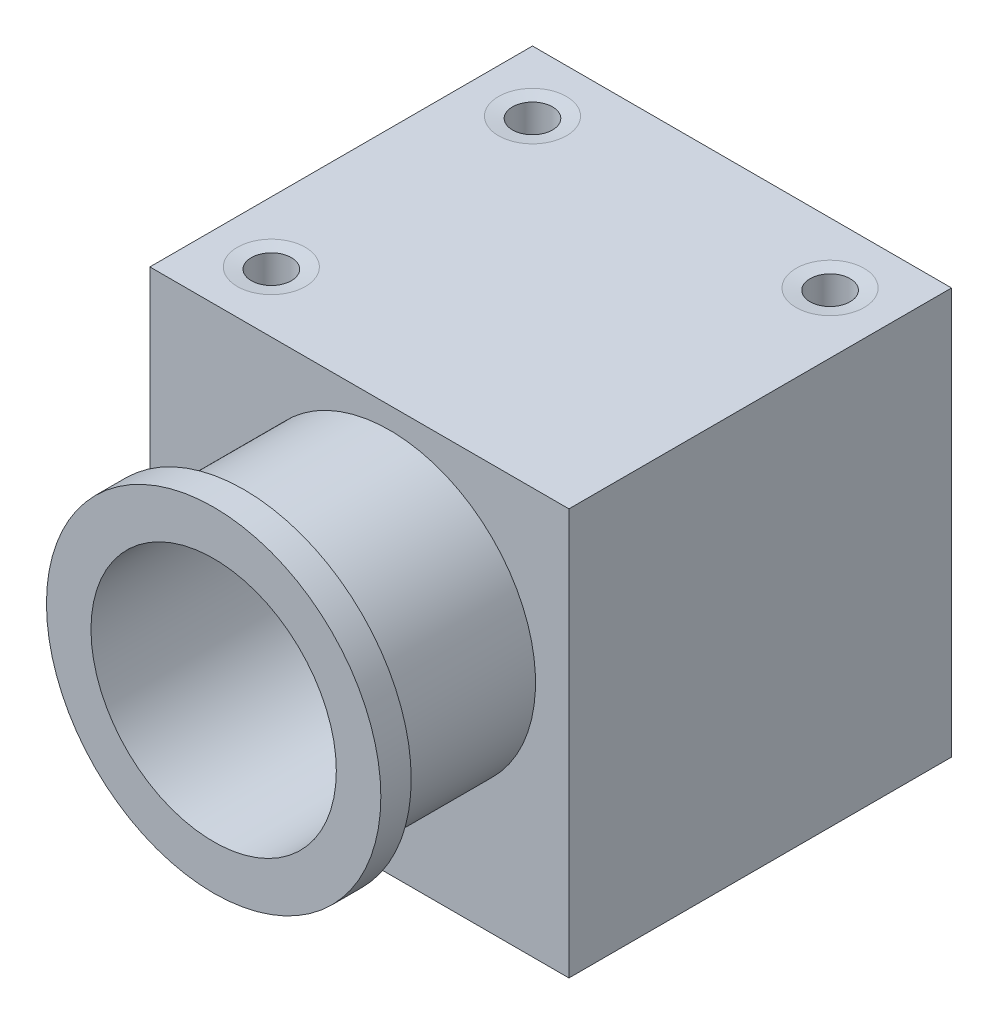
ISO-10303-21;
HEADER;
FILE_DESCRIPTION(('STEP AP214'),'2;1');
FILE_NAME('part.step','',(''),(''),'','','');
FILE_SCHEMA(('AUTOMOTIVE_DESIGN { 1 0 10303 214 1 1 1 1 }'));
ENDSEC;
DATA;
#1=APPLICATION_CONTEXT('core data for automotive mechanical design processes');
#2=APPLICATION_PROTOCOL_DEFINITION('international standard','automotive_design',2000,#1);
#3=PRODUCT_CONTEXT('',#1,'mechanical');
#4=PRODUCT('Part','Part','',(#3));
#5=PRODUCT_RELATED_PRODUCT_CATEGORY('part','',(#4));
#6=PRODUCT_DEFINITION_FORMATION('','',#4);
#7=PRODUCT_DEFINITION_CONTEXT('part definition',#1,'design');
#8=PRODUCT_DEFINITION('design','',#6,#7);
#9=PRODUCT_DEFINITION_SHAPE('','',#8);
#10=(LENGTH_UNIT() NAMED_UNIT(*) SI_UNIT(.MILLI.,.METRE.));
#11=(NAMED_UNIT(*) PLANE_ANGLE_UNIT() SI_UNIT($,.RADIAN.));
#12=(NAMED_UNIT(*) SI_UNIT($,.STERADIAN.) SOLID_ANGLE_UNIT());
#13=UNCERTAINTY_MEASURE_WITH_UNIT(LENGTH_MEASURE(1.E-05),#10,'distance_accuracy_value','');
#14=(GEOMETRIC_REPRESENTATION_CONTEXT(3) GLOBAL_UNCERTAINTY_ASSIGNED_CONTEXT((#13)) GLOBAL_UNIT_ASSIGNED_CONTEXT((#10,
#11,#12)) REPRESENTATION_CONTEXT('',''));
#15=CARTESIAN_POINT('',(0.,0.,0.));
#16=DIRECTION('',(0.,0.,1.));
#17=DIRECTION('',(1.,0.,0.));
#18=AXIS2_PLACEMENT_3D('',#15,#16,#17);
#19=CARTESIAN_POINT('',(0.,1.50369999999999,-18.288));
#20=DIRECTION('',(0.,0.,1.));
#21=DIRECTION('',(1.,0.,0.));
#22=AXIS2_PLACEMENT_3D('',#19,#20,#21);
#23=CYLINDRICAL_SURFACE('',#22,5.1308);
#24=CARTESIAN_POINT('',(0.,1.50369999999999,-18.2626));
#25=DIRECTION('',(0.,0.,-1.));
#26=DIRECTION('',(-1.,0.,0.));
#27=AXIS2_PLACEMENT_3D('',#24,#25,#26);
#28=CIRCLE('',#27,5.1308);
#29=CARTESIAN_POINT('',(-5.1308,1.50369999999999,-18.2626));
#30=VERTEX_POINT('',#29);
#31=EDGE_CURVE('E43',#30,#30,#28,.F.);
#32=ORIENTED_EDGE('',*,*,#31,.T.);
#33=EDGE_LOOP('',(#32));
#34=FACE_BOUND('',#33,.T.);
#35=CARTESIAN_POINT('',(0.,1.50369999999999,-18.288));
#36=DIRECTION('',(0.,0.,1.));
#37=DIRECTION('',(1.,0.,0.));
#38=AXIS2_PLACEMENT_3D('',#35,#36,#37);
#39=CIRCLE('',#38,5.1308);
#40=CARTESIAN_POINT('',(5.1308,1.50369999999999,-18.288));
#41=VERTEX_POINT('',#40);
#42=EDGE_CURVE('E204',#41,#41,#39,.T.);
#43=ORIENTED_EDGE('',*,*,#42,.F.);
#44=EDGE_LOOP('',(#43));
#45=FACE_BOUND('',#44,.T.);
#46=ADVANCED_FACE('F39',(#34,#45),#23,.F.);
#47=CARTESIAN_POINT('',(-7.493,8.49629999999999,-24.1554));
#48=DIRECTION('',(0.,-1.,0.));
#49=DIRECTION('',(0.,0.,-1.));
#50=AXIS2_PLACEMENT_3D('',#47,#48,#49);
#51=PLANE('',#50);
#52=CARTESIAN_POINT('',(-7.493,8.49629999999999,-20.828));
#53=DIRECTION('',(0.,1.,0.));
#54=DIRECTION('',(0.,0.,1.));
#55=AXIS2_PLACEMENT_3D('',#52,#53,#54);
#56=CIRCLE('',#55,1.4224);
#57=CARTESIAN_POINT('',(-7.493,8.49629999999999,-19.4056));
#58=VERTEX_POINT('',#57);
#59=EDGE_CURVE('E166',#58,#58,#56,.T.);
#60=ORIENTED_EDGE('',*,*,#59,.F.);
#61=EDGE_LOOP('',(#60));
#62=FACE_BOUND('',#61,.T.);
#63=DIRECTION('',(0.,0.,-1.));
#64=VECTOR('',#63,1.);
#65=CARTESIAN_POINT('',(-10.033,8.49629999999999,-23.368));
#66=LINE('',#65,#64);
#67=CARTESIAN_POINT('',(-10.033,8.49629999999999,-7.366));
#68=VERTEX_POINT('',#67);
#69=CARTESIAN_POINT('',(-10.033,8.49629999999999,-23.368));
#70=VERTEX_POINT('',#69);
#71=EDGE_CURVE('E156',#68,#70,#66,.T.);
#72=ORIENTED_EDGE('',*,*,#71,.F.);
#73=DIRECTION('',(-1.,0.,0.));
#74=VECTOR('',#73,1.);
#75=CARTESIAN_POINT('',(-7.493,8.49629999999999,-7.366));
#76=LINE('',#75,#74);
#77=CARTESIAN_POINT('',(7.493254,8.49629999999999,-7.366));
#78=VERTEX_POINT('',#77);
#79=EDGE_CURVE('E64',#78,#68,#76,.T.);
#80=ORIENTED_EDGE('',*,*,#79,.F.);
#81=DIRECTION('',(0.,0.,1.));
#82=VECTOR('',#81,1.);
#83=CARTESIAN_POINT('',(7.493254,8.49629999999999,-7.366));
#84=LINE('',#83,#82);
#85=CARTESIAN_POINT('',(7.493254,8.49629999999999,-23.368));
#86=VERTEX_POINT('',#85);
#87=EDGE_CURVE('E179',#86,#78,#84,.T.);
#88=ORIENTED_EDGE('',*,*,#87,.F.);
#89=DIRECTION('',(1.,0.,0.));
#90=VECTOR('',#89,1.);
#91=CARTESIAN_POINT('',(-7.493,8.49629999999999,-23.368));
#92=LINE('',#91,#90);
#93=EDGE_CURVE('E181',#70,#86,#92,.T.);
#94=ORIENTED_EDGE('',*,*,#93,.F.);
#95=EDGE_LOOP('',(#72,#80,#88,#94));
#96=FACE_BOUND('',#95,.T.);
#97=CARTESIAN_POINT('',(4.953254,8.49629999999999,-20.828));
#98=DIRECTION('',(0.,1.,0.));
#99=DIRECTION('',(0.,0.,1.));
#100=AXIS2_PLACEMENT_3D('',#97,#98,#99);
#101=CIRCLE('',#100,1.4224);
#102=CARTESIAN_POINT('',(4.953254,8.49629999999999,-19.4056));
#103=VERTEX_POINT('',#102);
#104=EDGE_CURVE('E162',#103,#103,#101,.T.);
#105=ORIENTED_EDGE('',*,*,#104,.F.);
#106=EDGE_LOOP('',(#105));
#107=FACE_BOUND('',#106,.T.);
#108=CARTESIAN_POINT('',(-7.493,8.49629999999999,-9.906));
#109=DIRECTION('',(0.,1.,0.));
#110=DIRECTION('',(0.,0.,1.));
#111=AXIS2_PLACEMENT_3D('',#108,#109,#110);
#112=CIRCLE('',#111,1.4224);
#113=CARTESIAN_POINT('',(-7.493,8.49629999999999,-8.4836));
#114=VERTEX_POINT('',#113);
#115=EDGE_CURVE('E159',#114,#114,#112,.T.);
#116=ORIENTED_EDGE('',*,*,#115,.F.);
#117=EDGE_LOOP('',(#116));
#118=FACE_BOUND('',#117,.T.);
#119=ADVANCED_FACE('F41',(#62,#96,#107,#118),#51,.F.);
#120=CARTESIAN_POINT('',(-7.493,-11.8237,-9.906));
#121=DIRECTION('',(0.,1.,0.));
#122=DIRECTION('',(0.,0.,1.));
#123=AXIS2_PLACEMENT_3D('',#120,#121,#122);
#124=CYLINDRICAL_SURFACE('',#123,0.838200000000001);
#125=CARTESIAN_POINT('',(-7.493,-8.49630000000001,-9.906));
#126=DIRECTION('',(0.,-1.,0.));
#127=DIRECTION('',(0.,0.,-1.));
#128=AXIS2_PLACEMENT_3D('',#125,#126,#127);
#129=CIRCLE('',#128,0.838200000000001);
#130=CARTESIAN_POINT('',(-7.493,-8.49630000000001,-10.7442));
#131=VERTEX_POINT('',#130);
#132=EDGE_CURVE('E221',#131,#131,#129,.T.);
#133=ORIENTED_EDGE('',*,*,#132,.T.);
#134=EDGE_LOOP('',(#133));
#135=FACE_BOUND('',#134,.T.);
#136=CARTESIAN_POINT('',(-7.493,8.41419604436686,-9.906));
#137=DIRECTION('',(0.,1.,0.));
#138=DIRECTION('',(0.,0.,1.));
#139=AXIS2_PLACEMENT_3D('',#136,#137,#138);
#140=CIRCLE('',#139,0.838200000000001);
#141=CARTESIAN_POINT('',(-7.493,8.41419604436686,-9.0678));
#142=VERTEX_POINT('',#141);
#143=EDGE_CURVE('E11',#142,#142,#140,.T.);
#144=ORIENTED_EDGE('',*,*,#143,.T.);
#145=EDGE_LOOP('',(#144));
#146=FACE_BOUND('',#145,.T.);
#147=ADVANCED_FACE('F258',(#135,#146),#124,.F.);
#148=CARTESIAN_POINT('',(-7.493,-11.8237,-20.828));
#149=DIRECTION('',(0.,1.,0.));
#150=DIRECTION('',(0.,0.,1.));
#151=AXIS2_PLACEMENT_3D('',#148,#149,#150);
#152=CYLINDRICAL_SURFACE('',#151,0.8382);
#153=CARTESIAN_POINT('',(-7.493,-8.49630000000001,-20.828));
#154=DIRECTION('',(0.,-1.,0.));
#155=DIRECTION('',(0.,0.,-1.));
#156=AXIS2_PLACEMENT_3D('',#153,#154,#155);
#157=CIRCLE('',#156,0.8382);
#158=CARTESIAN_POINT('',(-7.493,-8.49630000000001,-21.6662));
#159=VERTEX_POINT('',#158);
#160=EDGE_CURVE('E214',#159,#159,#157,.T.);
#161=ORIENTED_EDGE('',*,*,#160,.T.);
#162=EDGE_LOOP('',(#161));
#163=FACE_BOUND('',#162,.T.);
#164=CARTESIAN_POINT('',(-7.493,8.41419604436686,-20.828));
#165=DIRECTION('',(0.,1.,0.));
#166=DIRECTION('',(0.,0.,1.));
#167=AXIS2_PLACEMENT_3D('',#164,#165,#166);
#168=CIRCLE('',#167,0.8382);
#169=CARTESIAN_POINT('',(-7.493,8.41419604436686,-19.9898));
#170=VERTEX_POINT('',#169);
#171=EDGE_CURVE('E48',#170,#170,#168,.T.);
#172=ORIENTED_EDGE('',*,*,#171,.T.);
#173=EDGE_LOOP('',(#172));
#174=FACE_BOUND('',#173,.T.);
#175=ADVANCED_FACE('F318',(#163,#174),#152,.F.);
#176=CARTESIAN_POINT('',(-7.493,-8.49630000000001,-24.1554));
#177=DIRECTION('',(0.,-1.,0.));
#178=DIRECTION('',(0.,0.,-1.));
#179=AXIS2_PLACEMENT_3D('',#176,#177,#178);
#180=PLANE('',#179);
#181=DIRECTION('',(0.,0.,1.));
#182=VECTOR('',#181,1.);
#183=CARTESIAN_POINT('',(6.59129999999999,-8.49630000000001,-18.2626));
#184=LINE('',#183,#182);
#185=CARTESIAN_POINT('',(6.59129999999999,-8.49630000000001,-18.2626));
#186=VERTEX_POINT('',#185);
#187=CARTESIAN_POINT('',(6.59129999999999,-8.49630000000001,-17.4752));
#188=VERTEX_POINT('',#187);
#189=EDGE_CURVE('E56',#186,#188,#184,.T.);
#190=ORIENTED_EDGE('',*,*,#189,.F.);
#191=DIRECTION('',(1.,0.,0.));
#192=VECTOR('',#191,1.);
#193=CARTESIAN_POINT('',(-6.59130000000001,-8.49630000000001,-18.2626));
#194=LINE('',#193,#192);
#195=CARTESIAN_POINT('',(-6.59130000000001,-8.49630000000001,-18.2626));
#196=VERTEX_POINT('',#195);
#197=EDGE_CURVE('E128',#196,#186,#194,.T.);
#198=ORIENTED_EDGE('',*,*,#197,.F.);
#199=DIRECTION('',(0.,0.,-1.));
#200=VECTOR('',#199,1.);
#201=CARTESIAN_POINT('',(-6.59130000000001,-8.49630000000001,-18.2626));
#202=LINE('',#201,#200);
#203=CARTESIAN_POINT('',(-6.59130000000001,-8.49630000000001,-17.4752));
#204=VERTEX_POINT('',#203);
#205=EDGE_CURVE('E131',#204,#196,#202,.T.);
#206=ORIENTED_EDGE('',*,*,#205,.F.);
#207=DIRECTION('',(-1.,0.,0.));
#208=VECTOR('',#207,1.);
#209=CARTESIAN_POINT('',(-6.59130000000001,-8.49630000000001,-17.4752));
#210=LINE('',#209,#208);
#211=EDGE_CURVE('E137',#188,#204,#210,.T.);
#212=ORIENTED_EDGE('',*,*,#211,.F.);
#213=EDGE_LOOP('',(#190,#198,#206,#212));
#214=FACE_BOUND('',#213,.T.);
#215=ORIENTED_EDGE('',*,*,#160,.F.);
#216=EDGE_LOOP('',(#215));
#217=FACE_BOUND('',#216,.T.);
#218=DIRECTION('',(1.,0.,0.));
#219=VECTOR('',#218,1.);
#220=CARTESIAN_POINT('',(-7.493,-8.49630000000001,-7.366));
#221=LINE('',#220,#219);
#222=CARTESIAN_POINT('',(-10.033,-8.49630000000001,-7.366));
#223=VERTEX_POINT('',#222);
#224=CARTESIAN_POINT('',(7.493254,-8.49630000000001,-7.366));
#225=VERTEX_POINT('',#224);
#226=EDGE_CURVE('E199',#223,#225,#221,.T.);
#227=ORIENTED_EDGE('',*,*,#226,.F.);
#228=DIRECTION('',(0.,0.,1.));
#229=VECTOR('',#228,1.);
#230=CARTESIAN_POINT('',(-10.033,-8.49630000000001,-23.368));
#231=LINE('',#230,#229);
#232=CARTESIAN_POINT('',(-10.033,-8.49630000000001,-23.368));
#233=VERTEX_POINT('',#232);
#234=EDGE_CURVE('E150',#233,#223,#231,.T.);
#235=ORIENTED_EDGE('',*,*,#234,.F.);
#236=DIRECTION('',(-1.,0.,0.));
#237=VECTOR('',#236,1.);
#238=CARTESIAN_POINT('',(-7.493,-8.49630000000001,-23.368));
#239=LINE('',#238,#237);
#240=CARTESIAN_POINT('',(7.493254,-8.49630000000001,-23.368));
#241=VERTEX_POINT('',#240);
#242=EDGE_CURVE('E183',#241,#233,#239,.T.);
#243=ORIENTED_EDGE('',*,*,#242,.F.);
#244=DIRECTION('',(0.,0.,-1.));
#245=VECTOR('',#244,1.);
#246=CARTESIAN_POINT('',(7.493254,-8.49630000000001,-7.366));
#247=LINE('',#246,#245);
#248=EDGE_CURVE('E173',#225,#241,#247,.T.);
#249=ORIENTED_EDGE('',*,*,#248,.F.);
#250=EDGE_LOOP('',(#227,#235,#243,#249));
#251=FACE_BOUND('',#250,.T.);
#252=CARTESIAN_POINT('',(4.953254,-8.49630000000001,-20.828));
#253=DIRECTION('',(0.,-1.,0.));
#254=DIRECTION('',(0.,0.,-1.));
#255=AXIS2_PLACEMENT_3D('',#252,#253,#254);
#256=CIRCLE('',#255,0.838200000000003);
#257=CARTESIAN_POINT('',(4.953254,-8.49630000000001,-21.6662));
#258=VERTEX_POINT('',#257);
#259=EDGE_CURVE('E169',#258,#258,#256,.T.);
#260=ORIENTED_EDGE('',*,*,#259,.F.);
#261=EDGE_LOOP('',(#260));
#262=FACE_BOUND('',#261,.T.);
#263=ORIENTED_EDGE('',*,*,#132,.F.);
#264=EDGE_LOOP('',(#263));
#265=FACE_BOUND('',#264,.T.);
#266=ADVANCED_FACE('F315',(#214,#217,#251,#262,#265),#180,.T.);
#267=CARTESIAN_POINT('',(0.,1.50369999999999,-24.1554));
#268=DIRECTION('',(0.,0.,1.));
#269=DIRECTION('',(1.,0.,0.));
#270=AXIS2_PLACEMENT_3D('',#267,#268,#269);
#271=CYLINDRICAL_SURFACE('',#270,1.4224);
#272=CARTESIAN_POINT('',(0.,1.50369999999999,-19.558));
#273=DIRECTION('',(0.,0.,1.));
#274=DIRECTION('',(1.,0.,0.));
#275=AXIS2_PLACEMENT_3D('',#272,#273,#274);
#276=CIRCLE('',#275,1.4224);
#277=CARTESIAN_POINT('',(1.4224,1.50369999999999,-19.558));
#278=VERTEX_POINT('',#277);
#279=EDGE_CURVE('E211',#278,#278,#276,.F.);
#280=ORIENTED_EDGE('',*,*,#279,.F.);
#281=EDGE_LOOP('',(#280));
#282=FACE_BOUND('',#281,.T.);
#283=CARTESIAN_POINT('',(0.,1.50369999999999,-23.368));
#284=DIRECTION('',(0.,0.,-1.));
#285=DIRECTION('',(-1.,0.,0.));
#286=AXIS2_PLACEMENT_3D('',#283,#284,#285);
#287=CIRCLE('',#286,1.4224);
#288=CARTESIAN_POINT('',(-1.4224,1.50369999999999,-23.368));
#289=VERTEX_POINT('',#288);
#290=EDGE_CURVE('E185',#289,#289,#287,.F.);
#291=ORIENTED_EDGE('',*,*,#290,.F.);
#292=EDGE_LOOP('',(#291));
#293=FACE_BOUND('',#292,.T.);
#294=ADVANCED_FACE('F272',(#282,#293),#271,.F.);
#295=CARTESIAN_POINT('',(0.,0.,-7.366));
#296=DIRECTION('',(0.,0.,1.));
#297=DIRECTION('',(1.,0.,0.));
#298=AXIS2_PLACEMENT_3D('',#295,#296,#297);
#299=PLANE('',#298);
#300=ORIENTED_EDGE('',*,*,#79,.T.);
#301=DIRECTION('',(0.,1.,0.));
#302=VECTOR('',#301,1.);
#303=CARTESIAN_POINT('',(-10.033,8.49629999999999,-7.366));
#304=LINE('',#303,#302);
#305=EDGE_CURVE('E153',#223,#68,#304,.T.);
#306=ORIENTED_EDGE('',*,*,#305,.F.);
#307=ORIENTED_EDGE('',*,*,#226,.T.);
#308=DIRECTION('',(0.,-1.,0.));
#309=VECTOR('',#308,1.);
#310=CARTESIAN_POINT('',(7.493254,8.49629999999999,-7.366));
#311=LINE('',#310,#309);
#312=EDGE_CURVE('E170',#78,#225,#311,.T.);
#313=ORIENTED_EDGE('',*,*,#312,.F.);
#314=EDGE_LOOP('',(#300,#306,#307,#313));
#315=FACE_BOUND('',#314,.T.);
#316=CARTESIAN_POINT('',(0.,1.50369999999999,-7.366));
#317=DIRECTION('',(0.,0.,1.));
#318=DIRECTION('',(1.,0.,0.));
#319=AXIS2_PLACEMENT_3D('',#316,#317,#318);
#320=CIRCLE('',#319,6.096);
#321=CARTESIAN_POINT('',(-6.096,1.50369999999999,-7.366));
#322=VERTEX_POINT('',#321);
#323=EDGE_CURVE('E193',#322,#322,#320,.T.);
#324=ORIENTED_EDGE('',*,*,#323,.F.);
#325=EDGE_LOOP('',(#324));
#326=FACE_BOUND('',#325,.T.);
#327=ADVANCED_FACE('F264',(#315,#326),#299,.T.);
#328=CARTESIAN_POINT('',(0.,1.50369999999999,-17.4752));
#329=DIRECTION('',(0.,0.,1.));
#330=DIRECTION('',(1.,0.,0.));
#331=AXIS2_PLACEMENT_3D('',#328,#329,#330);
#332=CIRCLE('',#331,5.1308);
#333=CARTESIAN_POINT('',(5.1308,1.50369999999999,-17.4752));
#334=VERTEX_POINT('',#333);
#335=EDGE_CURVE('E143',#334,#334,#332,.F.);
#336=ORIENTED_EDGE('',*,*,#335,.T.);
#337=EDGE_LOOP('',(#336));
#338=FACE_BOUND('',#337,.T.);
#339=CARTESIAN_POINT('',(0.,1.50369999999999,0.));
#340=DIRECTION('',(0.,0.,1.));
#341=DIRECTION('',(1.,0.,0.));
#342=AXIS2_PLACEMENT_3D('',#339,#340,#341);
#343=CIRCLE('',#342,5.1308);
#344=CARTESIAN_POINT('',(5.1308,1.50369999999999,0.));
#345=VERTEX_POINT('',#344);
#346=EDGE_CURVE('E186',#345,#345,#343,.T.);
#347=ORIENTED_EDGE('',*,*,#346,.T.);
#348=EDGE_LOOP('',(#347));
#349=FACE_BOUND('',#348,.T.);
#350=ADVANCED_FACE('F254',(#338,#349),#23,.F.);
#351=CARTESIAN_POINT('',(0.,1.50369999999999,-19.558));
#352=DIRECTION('',(0.,0.,1.));
#353=DIRECTION('',(1.,0.,0.));
#354=AXIS2_PLACEMENT_3D('',#351,#352,#353);
#355=CYLINDRICAL_SURFACE('',#354,3.2639);
#356=CARTESIAN_POINT('',(0.,1.50369999999999,-19.558));
#357=DIRECTION('',(0.,0.,1.));
#358=DIRECTION('',(1.,0.,0.));
#359=AXIS2_PLACEMENT_3D('',#356,#357,#358);
#360=CIRCLE('',#359,3.2639);
#361=CARTESIAN_POINT('',(3.2639,1.50369999999999,-19.558));
#362=VERTEX_POINT('',#361);
#363=EDGE_CURVE('E208',#362,#362,#360,.T.);
#364=ORIENTED_EDGE('',*,*,#363,.F.);
#365=EDGE_LOOP('',(#364));
#366=FACE_BOUND('',#365,.T.);
#367=CARTESIAN_POINT('',(0.,1.50369999999999,-18.288));
#368=DIRECTION('',(0.,0.,1.));
#369=DIRECTION('',(1.,0.,0.));
#370=AXIS2_PLACEMENT_3D('',#367,#368,#369);
#371=CIRCLE('',#370,3.2639);
#372=CARTESIAN_POINT('',(3.2639,1.50369999999999,-18.288));
#373=VERTEX_POINT('',#372);
#374=EDGE_CURVE('E207',#373,#373,#371,.F.);
#375=ORIENTED_EDGE('',*,*,#374,.F.);
#376=EDGE_LOOP('',(#375));
#377=FACE_BOUND('',#376,.T.);
#378=ADVANCED_FACE('F263',(#366,#377),#355,.F.);
#379=CARTESIAN_POINT('',(0.,1.50369999999999,-19.558));
#380=DIRECTION('',(0.,0.,1.));
#381=DIRECTION('',(1.,0.,0.));
#382=AXIS2_PLACEMENT_3D('',#379,#380,#381);
#383=PLANE('',#382);
#384=ORIENTED_EDGE('',*,*,#363,.T.);
#385=EDGE_LOOP('',(#384));
#386=FACE_BOUND('',#385,.T.);
#387=ORIENTED_EDGE('',*,*,#279,.T.);
#388=EDGE_LOOP('',(#387));
#389=FACE_BOUND('',#388,.T.);
#390=ADVANCED_FACE('F269',(#386,#389),#383,.T.);
#391=CARTESIAN_POINT('',(0.,1.50369999999999,-18.288));
#392=DIRECTION('',(0.,0.,1.));
#393=DIRECTION('',(1.,0.,0.));
#394=AXIS2_PLACEMENT_3D('',#391,#392,#393);
#395=PLANE('',#394);
#396=ORIENTED_EDGE('',*,*,#42,.T.);
#397=EDGE_LOOP('',(#396));
#398=FACE_BOUND('',#397,.T.);
#399=ORIENTED_EDGE('',*,*,#374,.T.);
#400=EDGE_LOOP('',(#399));
#401=FACE_BOUND('',#400,.T.);
#402=ADVANCED_FACE('F298',(#398,#401),#395,.T.);
#403=CARTESIAN_POINT('',(0.,1.50369999999999,-1.27));
#404=DIRECTION('',(0.,0.,-1.));
#405=DIRECTION('',(-1.,0.,0.));
#406=AXIS2_PLACEMENT_3D('',#403,#404,#405);
#407=CYLINDRICAL_SURFACE('',#406,6.096);
#408=CARTESIAN_POINT('',(0.,1.50369999999999,-1.27));
#409=DIRECTION('',(0.,0.,1.));
#410=DIRECTION('',(1.,0.,0.));
#411=AXIS2_PLACEMENT_3D('',#408,#409,#410);
#412=CIRCLE('',#411,6.096);
#413=CARTESIAN_POINT('',(-6.096,1.50369999999999,-1.27));
#414=VERTEX_POINT('',#413);
#415=EDGE_CURVE('E196',#414,#414,#412,.T.);
#416=CARTESIAN_POINT('',(-6.096,1.50369999999999,-1.27));
#417=CARTESIAN_POINT('',(-6.096,1.50369999999999,-1.3335));
#418=CARTESIAN_POINT('',(-6.096,1.50369999999999,-1.397));
#419=CARTESIAN_POINT('',(-6.096,1.50369999999999,-1.524));
#420=CARTESIAN_POINT('',(-6.096,1.50369999999999,-1.5875));
#421=CARTESIAN_POINT('',(-6.096,1.50369999999999,-1.7145));
#422=CARTESIAN_POINT('',(-6.096,1.50369999999999,-1.778));
#423=CARTESIAN_POINT('',(-6.096,1.50369999999999,-1.905));
#424=CARTESIAN_POINT('',(-6.096,1.50369999999999,-1.9685));
#425=CARTESIAN_POINT('',(-6.096,1.50369999999999,-2.0955));
#426=CARTESIAN_POINT('',(-6.096,1.50369999999999,-2.159));
#427=CARTESIAN_POINT('',(-6.096,1.50369999999999,-2.286));
#428=CARTESIAN_POINT('',(-6.096,1.50369999999999,-2.3495));
#429=CARTESIAN_POINT('',(-6.096,1.50369999999999,-2.4765));
#430=CARTESIAN_POINT('',(-6.096,1.50369999999999,-2.54));
#431=CARTESIAN_POINT('',(-6.096,1.50369999999999,-2.667));
#432=CARTESIAN_POINT('',(-6.096,1.50369999999999,-2.7305));
#433=CARTESIAN_POINT('',(-6.096,1.50369999999999,-2.8575));
#434=CARTESIAN_POINT('',(-6.096,1.50369999999999,-2.921));
#435=CARTESIAN_POINT('',(-6.096,1.50369999999999,-3.048));
#436=CARTESIAN_POINT('',(-6.096,1.50369999999999,-3.1115));
#437=CARTESIAN_POINT('',(-6.096,1.50369999999999,-3.2385));
#438=CARTESIAN_POINT('',(-6.096,1.50369999999999,-3.302));
#439=CARTESIAN_POINT('',(-6.096,1.50369999999999,-3.429));
#440=CARTESIAN_POINT('',(-6.096,1.50369999999999,-3.4925));
#441=CARTESIAN_POINT('',(-6.096,1.50369999999999,-3.6195));
#442=CARTESIAN_POINT('',(-6.096,1.50369999999999,-3.683));
#443=CARTESIAN_POINT('',(-6.096,1.50369999999999,-3.81));
#444=CARTESIAN_POINT('',(-6.096,1.50369999999999,-3.8735));
#445=CARTESIAN_POINT('',(-6.096,1.50369999999999,-4.0005));
#446=CARTESIAN_POINT('',(-6.096,1.50369999999999,-4.064));
#447=CARTESIAN_POINT('',(-6.096,1.50369999999999,-4.191));
#448=CARTESIAN_POINT('',(-6.096,1.50369999999999,-4.2545));
#449=CARTESIAN_POINT('',(-6.096,1.50369999999999,-4.3815));
#450=CARTESIAN_POINT('',(-6.096,1.50369999999999,-4.445));
#451=CARTESIAN_POINT('',(-6.096,1.50369999999999,-4.572));
#452=CARTESIAN_POINT('',(-6.096,1.50369999999999,-4.6355));
#453=CARTESIAN_POINT('',(-6.096,1.50369999999999,-4.7625));
#454=CARTESIAN_POINT('',(-6.096,1.50369999999999,-4.826));
#455=CARTESIAN_POINT('',(-6.096,1.50369999999999,-4.953));
#456=CARTESIAN_POINT('',(-6.096,1.50369999999999,-5.0165));
#457=CARTESIAN_POINT('',(-6.096,1.50369999999999,-5.1435));
#458=CARTESIAN_POINT('',(-6.096,1.50369999999999,-5.207));
#459=CARTESIAN_POINT('',(-6.096,1.50369999999999,-5.334));
#460=CARTESIAN_POINT('',(-6.096,1.50369999999999,-5.3975));
#461=CARTESIAN_POINT('',(-6.096,1.50369999999999,-5.5245));
#462=CARTESIAN_POINT('',(-6.096,1.50369999999999,-5.588));
#463=CARTESIAN_POINT('',(-6.096,1.50369999999999,-5.715));
#464=CARTESIAN_POINT('',(-6.096,1.50369999999999,-5.7785));
#465=CARTESIAN_POINT('',(-6.096,1.50369999999999,-5.9055));
#466=CARTESIAN_POINT('',(-6.096,1.50369999999999,-5.969));
#467=CARTESIAN_POINT('',(-6.096,1.50369999999999,-6.096));
#468=CARTESIAN_POINT('',(-6.096,1.50369999999999,-6.1595));
#469=CARTESIAN_POINT('',(-6.096,1.50369999999999,-6.2865));
#470=CARTESIAN_POINT('',(-6.096,1.50369999999999,-6.35));
#471=CARTESIAN_POINT('',(-6.096,1.50369999999999,-6.477));
#472=CARTESIAN_POINT('',(-6.096,1.50369999999999,-6.5405));
#473=CARTESIAN_POINT('',(-6.096,1.50369999999999,-6.6675));
#474=CARTESIAN_POINT('',(-6.096,1.50369999999999,-6.731));
#475=CARTESIAN_POINT('',(-6.096,1.50369999999999,-6.858));
#476=CARTESIAN_POINT('',(-6.096,1.50369999999999,-6.9215));
#477=CARTESIAN_POINT('',(-6.096,1.50369999999999,-7.0485));
#478=CARTESIAN_POINT('',(-6.096,1.50369999999999,-7.112));
#479=CARTESIAN_POINT('',(-6.096,1.50369999999999,-7.239));
#480=CARTESIAN_POINT('',(-6.096,1.50369999999999,-7.3025));
#481=CARTESIAN_POINT('',(-6.096,1.50369999999999,-7.366));
#482=B_SPLINE_CURVE_WITH_KNOTS('',3,(#416,#417,#418,#419,#420,#421,#422,#423,#424,#425,#426,
#427,#428,#429,#430,#431,#432,#433,#434,#435,#436,#437,#438,#439,#440,#441,#442,#443,#444,#445,
#446,#447,#448,#449,#450,#451,#452,#453,#454,#455,#456,#457,#458,#459,#460,#461,#462,#463,#464,
#465,#466,#467,#468,#469,#470,#471,#472,#473,#474,#475,#476,#477,#478,#479,#480,#481),
.UNSPECIFIED.,.F.,.F.,(4,2,2,2,2,2,2,2,2,2,2,2,2,2,2,2,2,2,2,2,2,2,2,2,2,2,2,2,2,2,2,2,4),(0.,
0.1905,0.381,0.5715,0.762,0.9525,1.143,1.3335,1.524,1.7145,1.905,2.0955,2.286,2.4765,2.667,
2.8575,3.048,3.2385,3.429,3.6195,3.81,4.0005,4.191,4.3815,4.572,4.7625,4.953,5.1435,5.334,
5.5245,5.715,5.9055,6.096),.UNSPECIFIED.);
#483=EDGE_CURVE('BSEAM291',#414,#322,#482,.T.);
#484=ORIENTED_EDGE('',*,*,#415,.F.);
#485=ORIENTED_EDGE('',*,*,#323,.T.);
#486=ORIENTED_EDGE('',*,*,#483,.T.);
#487=ORIENTED_EDGE('',*,*,#483,.F.);
#488=EDGE_LOOP('',(#484,#486,#485,#487));
#489=FACE_BOUND('',#488,.T.);
#490=ADVANCED_FACE('F291',(#489),#407,.T.);
#491=CARTESIAN_POINT('',(0.,1.50369999999999,-1.27));
#492=DIRECTION('',(0.,0.,1.));
#493=DIRECTION('',(1.,0.,0.));
#494=AXIS2_PLACEMENT_3D('',#491,#492,#493);
#495=PLANE('',#494);
#496=CARTESIAN_POINT('',(0.,1.50369999999999,-1.27));
#497=DIRECTION('',(0.,0.,1.));
#498=DIRECTION('',(1.,0.,0.));
#499=AXIS2_PLACEMENT_3D('',#496,#497,#498);
#500=CIRCLE('',#499,6.9926);
#501=CARTESIAN_POINT('',(6.9926,1.50369999999999,-1.27));
#502=VERTEX_POINT('',#501);
#503=EDGE_CURVE('E189',#502,#502,#500,.T.);
#504=ORIENTED_EDGE('',*,*,#503,.F.);
#505=EDGE_LOOP('',(#504));
#506=FACE_BOUND('',#505,.T.);
#507=ORIENTED_EDGE('',*,*,#415,.T.);
#508=EDGE_LOOP('',(#507));
#509=FACE_BOUND('',#508,.T.);
#510=ADVANCED_FACE('F281',(#506,#509),#495,.F.);
#511=CARTESIAN_POINT('',(0.,1.50369999999999,0.));
#512=DIRECTION('',(0.,0.,1.));
#513=DIRECTION('',(1.,0.,0.));
#514=AXIS2_PLACEMENT_3D('',#511,#512,#513);
#515=PLANE('',#514);
#516=CARTESIAN_POINT('',(0.,1.50369999999999,0.));
#517=DIRECTION('',(0.,0.,1.));
#518=DIRECTION('',(1.,0.,0.));
#519=AXIS2_PLACEMENT_3D('',#516,#517,#518);
#520=CIRCLE('',#519,6.9926);
#521=CARTESIAN_POINT('',(6.9926,1.50369999999999,0.));
#522=VERTEX_POINT('',#521);
#523=EDGE_CURVE('E190',#522,#522,#520,.T.);
#524=ORIENTED_EDGE('',*,*,#523,.T.);
#525=EDGE_LOOP('',(#524));
#526=FACE_BOUND('',#525,.T.);
#527=ORIENTED_EDGE('',*,*,#346,.F.);
#528=EDGE_LOOP('',(#527));
#529=FACE_BOUND('',#528,.T.);
#530=ADVANCED_FACE('F278',(#526,#529),#515,.T.);
#531=CARTESIAN_POINT('',(0.,1.50369999999999,0.));
#532=DIRECTION('',(0.,0.,-1.));
#533=DIRECTION('',(-1.,0.,0.));
#534=AXIS2_PLACEMENT_3D('',#531,#532,#533);
#535=CYLINDRICAL_SURFACE('',#534,6.9926);
#536=ORIENTED_EDGE('',*,*,#523,.F.);
#537=EDGE_LOOP('',(#536));
#538=FACE_BOUND('',#537,.T.);
#539=ORIENTED_EDGE('',*,*,#503,.T.);
#540=EDGE_LOOP('',(#539));
#541=FACE_BOUND('',#540,.T.);
#542=ADVANCED_FACE('F280',(#538,#541),#535,.T.);
#543=CARTESIAN_POINT('',(0.,0.,-23.368));
#544=DIRECTION('',(0.,0.,-1.));
#545=DIRECTION('',(-1.,0.,0.));
#546=AXIS2_PLACEMENT_3D('',#543,#544,#545);
#547=PLANE('',#546);
#548=ORIENTED_EDGE('',*,*,#242,.T.);
#549=DIRECTION('',(0.,-1.,0.));
#550=VECTOR('',#549,1.);
#551=CARTESIAN_POINT('',(-10.033,8.49629999999999,-23.368));
#552=LINE('',#551,#550);
#553=EDGE_CURVE('E147',#70,#233,#552,.T.);
#554=ORIENTED_EDGE('',*,*,#553,.F.);
#555=ORIENTED_EDGE('',*,*,#93,.T.);
#556=DIRECTION('',(0.,1.,0.));
#557=VECTOR('',#556,1.);
#558=CARTESIAN_POINT('',(7.493254,8.49629999999999,-23.368));
#559=LINE('',#558,#557);
#560=EDGE_CURVE('E176',#241,#86,#559,.T.);
#561=ORIENTED_EDGE('',*,*,#560,.F.);
#562=EDGE_LOOP('',(#548,#554,#555,#561));
#563=FACE_BOUND('',#562,.T.);
#564=ORIENTED_EDGE('',*,*,#290,.T.);
#565=EDGE_LOOP('',(#564));
#566=FACE_BOUND('',#565,.T.);
#567=ADVANCED_FACE('F288',(#563,#566),#547,.T.);
#568=CARTESIAN_POINT('',(7.493254,0.,0.));
#569=DIRECTION('',(1.,0.,0.));
#570=DIRECTION('',(0.,0.,-1.));
#571=AXIS2_PLACEMENT_3D('',#568,#569,#570);
#572=PLANE('',#571);
#573=ORIENTED_EDGE('',*,*,#312,.T.);
#574=ORIENTED_EDGE('',*,*,#248,.T.);
#575=ORIENTED_EDGE('',*,*,#560,.T.);
#576=ORIENTED_EDGE('',*,*,#87,.T.);
#577=EDGE_LOOP('',(#573,#574,#575,#576));
#578=FACE_BOUND('',#577,.T.);
#579=ADVANCED_FACE('F360',(#578),#572,.T.);
#580=CARTESIAN_POINT('',(4.953254,-11.8237,-20.828));
#581=DIRECTION('',(0.,1.,0.));
#582=DIRECTION('',(0.,0.,1.));
#583=AXIS2_PLACEMENT_3D('',#580,#581,#582);
#584=CYLINDRICAL_SURFACE('',#583,0.838200000000003);
#585=CARTESIAN_POINT('',(4.953254,8.41419604436686,-20.828));
#586=DIRECTION('',(0.,1.,0.));
#587=DIRECTION('',(0.,0.,1.));
#588=AXIS2_PLACEMENT_3D('',#585,#586,#587);
#589=CIRCLE('',#588,0.838200000000003);
#590=CARTESIAN_POINT('',(4.953254,8.41419604436686,-19.9898));
#591=VERTEX_POINT('',#590);
#592=EDGE_CURVE('E165',#591,#591,#589,.T.);
#593=ORIENTED_EDGE('',*,*,#592,.T.);
#594=EDGE_LOOP('',(#593));
#595=FACE_BOUND('',#594,.T.);
#596=ORIENTED_EDGE('',*,*,#259,.T.);
#597=EDGE_LOOP('',(#596));
#598=FACE_BOUND('',#597,.T.);
#599=ADVANCED_FACE('F356',(#595,#598),#584,.F.);
#600=CARTESIAN_POINT('',(-7.493,8.49629999999999,-20.828));
#601=DIRECTION('',(0.,1.,0.));
#602=DIRECTION('',(0.,0.,1.));
#603=AXIS2_PLACEMENT_3D('',#600,#601,#602);
#604=CONICAL_SURFACE('',#603,1.4224,1.43116998663535);
#605=ORIENTED_EDGE('',*,*,#171,.F.);
#606=EDGE_LOOP('',(#605));
#607=FACE_BOUND('',#606,.T.);
#608=ORIENTED_EDGE('',*,*,#59,.T.);
#609=EDGE_LOOP('',(#608));
#610=FACE_BOUND('',#609,.T.);
#611=ADVANCED_FACE('F350',(#607,#610),#604,.F.);
#612=CARTESIAN_POINT('',(4.953254,8.49629999999999,-20.828));
#613=DIRECTION('',(0.,1.,0.));
#614=DIRECTION('',(0.,0.,1.));
#615=AXIS2_PLACEMENT_3D('',#612,#613,#614);
#616=CONICAL_SURFACE('',#615,1.4224,1.43116998663535);
#617=ORIENTED_EDGE('',*,*,#104,.T.);
#618=EDGE_LOOP('',(#617));
#619=FACE_BOUND('',#618,.T.);
#620=ORIENTED_EDGE('',*,*,#592,.F.);
#621=EDGE_LOOP('',(#620));
#622=FACE_BOUND('',#621,.T.);
#623=ADVANCED_FACE('F343',(#619,#622),#616,.F.);
#624=CARTESIAN_POINT('',(-7.493,8.49629999999999,-9.906));
#625=DIRECTION('',(0.,1.,0.));
#626=DIRECTION('',(0.,0.,1.));
#627=AXIS2_PLACEMENT_3D('',#624,#625,#626);
#628=CONICAL_SURFACE('',#627,1.4224,1.43116998663535);
#629=ORIENTED_EDGE('',*,*,#143,.F.);
#630=EDGE_LOOP('',(#629));
#631=FACE_BOUND('',#630,.T.);
#632=ORIENTED_EDGE('',*,*,#115,.T.);
#633=EDGE_LOOP('',(#632));
#634=FACE_BOUND('',#633,.T.);
#635=ADVANCED_FACE('F247',(#631,#634),#628,.F.);
#636=CARTESIAN_POINT('',(-10.033,0.,0.));
#637=DIRECTION('',(-1.,0.,0.));
#638=DIRECTION('',(0.,0.,1.));
#639=AXIS2_PLACEMENT_3D('',#636,#637,#638);
#640=PLANE('',#639);
#641=ORIENTED_EDGE('',*,*,#553,.T.);
#642=ORIENTED_EDGE('',*,*,#234,.T.);
#643=ORIENTED_EDGE('',*,*,#305,.T.);
#644=ORIENTED_EDGE('',*,*,#71,.T.);
#645=EDGE_LOOP('',(#641,#642,#643,#644));
#646=FACE_BOUND('',#645,.T.);
#647=ADVANCED_FACE('F239',(#646),#640,.T.);
#648=CARTESIAN_POINT('',(-6.59130000000001,7.75969999999999,-18.2626));
#649=DIRECTION('',(0.,0.,-1.));
#650=DIRECTION('',(-1.,0.,0.));
#651=AXIS2_PLACEMENT_3D('',#648,#649,#650);
#652=PLANE('',#651);
#653=ORIENTED_EDGE('',*,*,#197,.T.);
#654=DIRECTION('',(0.,-1.,0.));
#655=VECTOR('',#654,1.);
#656=CARTESIAN_POINT('',(6.59129999999999,7.75969999999999,-18.2626));
#657=LINE('',#656,#655);
#658=CARTESIAN_POINT('',(6.59129999999999,7.75969999999999,-18.2626));
#659=VERTEX_POINT('',#658);
#660=EDGE_CURVE('E141',#659,#186,#657,.T.);
#661=ORIENTED_EDGE('',*,*,#660,.F.);
#662=DIRECTION('',(1.,0.,0.));
#663=VECTOR('',#662,1.);
#664=CARTESIAN_POINT('',(-6.59130000000001,7.75969999999999,-18.2626));
#665=LINE('',#664,#663);
#666=CARTESIAN_POINT('',(-6.59130000000001,7.75969999999999,-18.2626));
#667=VERTEX_POINT('',#666);
#668=EDGE_CURVE('E115',#667,#659,#665,.T.);
#669=ORIENTED_EDGE('',*,*,#668,.F.);
#670=DIRECTION('',(0.,-1.,0.));
#671=VECTOR('',#670,1.);
#672=CARTESIAN_POINT('',(-6.59130000000001,7.75969999999999,-18.2626));
#673=LINE('',#672,#671);
#674=EDGE_CURVE('E144',#667,#196,#673,.T.);
#675=ORIENTED_EDGE('',*,*,#674,.T.);
#676=EDGE_LOOP('',(#653,#661,#669,#675));
#677=FACE_BOUND('',#676,.T.);
#678=ORIENTED_EDGE('',*,*,#31,.F.);
#679=EDGE_LOOP('',(#678));
#680=FACE_BOUND('',#679,.T.);
#681=ADVANCED_FACE('F237',(#677,#680),#652,.F.);
#682=CARTESIAN_POINT('',(-6.59130000000001,7.75969999999999,-17.4752));
#683=DIRECTION('',(0.,0.,1.));
#684=DIRECTION('',(1.,0.,0.));
#685=AXIS2_PLACEMENT_3D('',#682,#683,#684);
#686=PLANE('',#685);
#687=ORIENTED_EDGE('',*,*,#211,.T.);
#688=DIRECTION('',(0.,-1.,0.));
#689=VECTOR('',#688,1.);
#690=CARTESIAN_POINT('',(-6.59130000000001,7.75969999999999,-17.4752));
#691=LINE('',#690,#689);
#692=CARTESIAN_POINT('',(-6.59130000000001,7.75969999999999,-17.4752));
#693=VERTEX_POINT('',#692);
#694=EDGE_CURVE('E114',#693,#204,#691,.T.);
#695=ORIENTED_EDGE('',*,*,#694,.F.);
#696=DIRECTION('',(-1.,0.,0.));
#697=VECTOR('',#696,1.);
#698=CARTESIAN_POINT('',(-6.59130000000001,7.75969999999999,-17.4752));
#699=LINE('',#698,#697);
#700=CARTESIAN_POINT('',(6.59129999999999,7.75969999999999,-17.4752));
#701=VERTEX_POINT('',#700);
#702=EDGE_CURVE('E118',#701,#693,#699,.T.);
#703=ORIENTED_EDGE('',*,*,#702,.F.);
#704=DIRECTION('',(0.,-1.,0.));
#705=VECTOR('',#704,1.);
#706=CARTESIAN_POINT('',(6.59129999999999,7.75969999999999,-17.4752));
#707=LINE('',#706,#705);
#708=EDGE_CURVE('E105',#701,#188,#707,.T.);
#709=ORIENTED_EDGE('',*,*,#708,.T.);
#710=EDGE_LOOP('',(#687,#695,#703,#709));
#711=FACE_BOUND('',#710,.T.);
#712=ORIENTED_EDGE('',*,*,#335,.F.);
#713=EDGE_LOOP('',(#712));
#714=FACE_BOUND('',#713,.T.);
#715=ADVANCED_FACE('F119',(#711,#714),#686,.F.);
#716=CARTESIAN_POINT('',(6.59129999999999,7.75969999999999,-18.2626));
#717=DIRECTION('',(1.,0.,0.));
#718=DIRECTION('',(0.,0.,-1.));
#719=AXIS2_PLACEMENT_3D('',#716,#717,#718);
#720=PLANE('',#719);
#721=ORIENTED_EDGE('',*,*,#189,.T.);
#722=ORIENTED_EDGE('',*,*,#708,.F.);
#723=DIRECTION('',(0.,0.,1.));
#724=VECTOR('',#723,1.);
#725=CARTESIAN_POINT('',(6.59129999999999,7.75969999999999,-18.2626));
#726=LINE('',#725,#724);
#727=EDGE_CURVE('E109',#659,#701,#726,.T.);
#728=ORIENTED_EDGE('',*,*,#727,.F.);
#729=ORIENTED_EDGE('',*,*,#660,.T.);
#730=EDGE_LOOP('',(#721,#722,#728,#729));
#731=FACE_BOUND('',#730,.T.);
#732=ADVANCED_FACE('F107',(#731),#720,.F.);
#733=CARTESIAN_POINT('',(-6.59130000000001,7.75969999999999,-18.2626));
#734=DIRECTION('',(-1.,0.,0.));
#735=DIRECTION('',(0.,0.,1.));
#736=AXIS2_PLACEMENT_3D('',#733,#734,#735);
#737=PLANE('',#736);
#738=ORIENTED_EDGE('',*,*,#205,.T.);
#739=ORIENTED_EDGE('',*,*,#674,.F.);
#740=DIRECTION('',(0.,0.,-1.));
#741=VECTOR('',#740,1.);
#742=CARTESIAN_POINT('',(-6.59130000000001,7.75969999999999,-18.2626));
#743=LINE('',#742,#741);
#744=EDGE_CURVE('E124',#693,#667,#743,.T.);
#745=ORIENTED_EDGE('',*,*,#744,.F.);
#746=ORIENTED_EDGE('',*,*,#694,.T.);
#747=EDGE_LOOP('',(#738,#739,#745,#746));
#748=FACE_BOUND('',#747,.T.);
#749=ADVANCED_FACE('F516',(#748),#737,.F.);
#750=CARTESIAN_POINT('',(0.,7.75969999999999,0.));
#751=DIRECTION('',(0.,1.,0.));
#752=DIRECTION('',(0.,0.,1.));
#753=AXIS2_PLACEMENT_3D('',#750,#751,#752);
#754=PLANE('',#753);
#755=ORIENTED_EDGE('',*,*,#727,.T.);
#756=ORIENTED_EDGE('',*,*,#702,.T.);
#757=ORIENTED_EDGE('',*,*,#744,.T.);
#758=ORIENTED_EDGE('',*,*,#668,.T.);
#759=EDGE_LOOP('',(#755,#756,#757,#758));
#760=FACE_BOUND('',#759,.T.);
#761=ADVANCED_FACE('F126',(#760),#754,.F.);
#762=CLOSED_SHELL('',(#46,#119,#147,#175,#266,#294,#327,#350,#378,#390,#402,#490,#510,#530,#542,
#567,#579,#599,#611,#623,#635,#647,#681,#715,#732,#749,#761));
#763=MANIFOLD_SOLID_BREP('B2',#762);
#764=ADVANCED_BREP_SHAPE_REPRESENTATION('',(#18,#763),#14);
#765=SHAPE_DEFINITION_REPRESENTATION(#9,#764);
ENDSEC;
END-ISO-10303-21;
